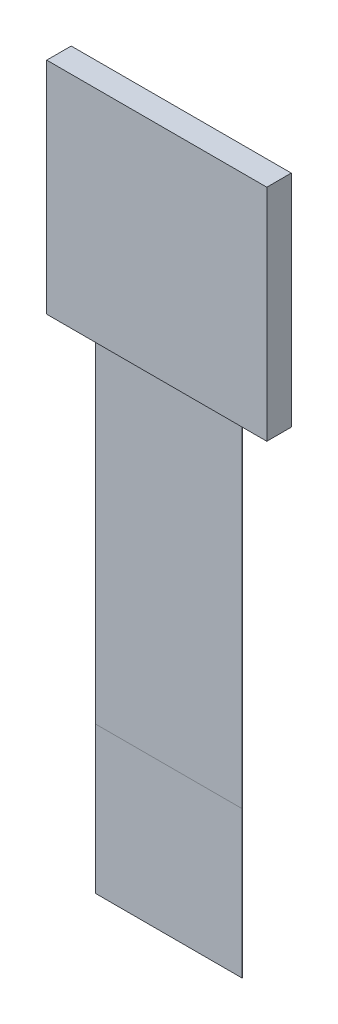
ISO-10303-21;
HEADER;
FILE_DESCRIPTION(('STEP AP214'),'2;1');
FILE_NAME('part.step','',(''),(''),'','','');
FILE_SCHEMA(('AUTOMOTIVE_DESIGN { 1 0 10303 214 1 1 1 1 }'));
ENDSEC;
DATA;
#1=APPLICATION_CONTEXT('core data for automotive mechanical design processes');
#2=APPLICATION_PROTOCOL_DEFINITION('international standard','automotive_design',2000,#1);
#3=PRODUCT_CONTEXT('',#1,'mechanical');
#4=PRODUCT('Part','Part','',(#3));
#5=PRODUCT_RELATED_PRODUCT_CATEGORY('part','',(#4));
#6=PRODUCT_DEFINITION_FORMATION('','',#4);
#7=PRODUCT_DEFINITION_CONTEXT('part definition',#1,'design');
#8=PRODUCT_DEFINITION('design','',#6,#7);
#9=PRODUCT_DEFINITION_SHAPE('','',#8);
#10=(LENGTH_UNIT() NAMED_UNIT(*) SI_UNIT(.MILLI.,.METRE.));
#11=(NAMED_UNIT(*) PLANE_ANGLE_UNIT() SI_UNIT($,.RADIAN.));
#12=(NAMED_UNIT(*) SI_UNIT($,.STERADIAN.) SOLID_ANGLE_UNIT());
#13=UNCERTAINTY_MEASURE_WITH_UNIT(LENGTH_MEASURE(1.E-05),#10,'distance_accuracy_value','');
#14=(GEOMETRIC_REPRESENTATION_CONTEXT(3) GLOBAL_UNCERTAINTY_ASSIGNED_CONTEXT((#13)) GLOBAL_UNIT_ASSIGNED_CONTEXT((#10,
#11,#12)) REPRESENTATION_CONTEXT('',''));
#15=CARTESIAN_POINT('',(0.,0.,0.));
#16=DIRECTION('',(0.,0.,1.));
#17=DIRECTION('',(1.,0.,0.));
#18=AXIS2_PLACEMENT_3D('',#15,#16,#17);
#19=CARTESIAN_POINT('',(-15.,0.,0.075));
#20=DIRECTION('',(1.,0.,0.));
#21=DIRECTION('',(0.,1.,0.));
#22=AXIS2_PLACEMENT_3D('',#19,#20,#21);
#23=PLANE('',#22);
#24=DIRECTION('',(0.,-1.,0.));
#25=VECTOR('',#24,1.);
#26=CARTESIAN_POINT('',(-15.,0.,-0.075));
#27=LINE('',#26,#25);
#28=CARTESIAN_POINT('',(-15.,0.,-0.075));
#29=VERTEX_POINT('',#28);
#30=CARTESIAN_POINT('',(-15.,-70.,-0.07625));
#31=VERTEX_POINT('',#30);
#32=EDGE_CURVE('E140',#29,#31,#27,.T.);
#33=ORIENTED_EDGE('',*,*,#32,.T.);
#34=DIRECTION('',(0.,-1.,0.));
#35=VECTOR('',#34,1.);
#36=CARTESIAN_POINT('',(-15.,0.,-0.0775));
#37=LINE('',#36,#35);
#38=CARTESIAN_POINT('',(-15.,-100.,-0.0775));
#39=VERTEX_POINT('',#38);
#40=EDGE_CURVE('E162',#31,#39,#37,.T.);
#41=ORIENTED_EDGE('',*,*,#40,.T.);
#42=DIRECTION('',(0.,0.,-1.));
#43=VECTOR('',#42,1.);
#44=CARTESIAN_POINT('',(-15.,-100.,0.0775));
#45=LINE('',#44,#43);
#46=CARTESIAN_POINT('',(-15.,-100.,0.0775));
#47=VERTEX_POINT('',#46);
#48=EDGE_CURVE('E118',#47,#39,#45,.T.);
#49=ORIENTED_EDGE('',*,*,#48,.F.);
#50=DIRECTION('',(0.,-1.,0.));
#51=VECTOR('',#50,1.);
#52=CARTESIAN_POINT('',(-15.,0.,0.0775));
#53=LINE('',#52,#51);
#54=CARTESIAN_POINT('',(-15.,-70.,0.07625));
#55=VERTEX_POINT('',#54);
#56=EDGE_CURVE('E120',#55,#47,#53,.T.);
#57=ORIENTED_EDGE('',*,*,#56,.F.);
#58=DIRECTION('',(0.,-1.,0.));
#59=VECTOR('',#58,1.);
#60=CARTESIAN_POINT('',(-15.,0.,0.075));
#61=LINE('',#60,#59);
#62=CARTESIAN_POINT('',(-15.,0.,0.075));
#63=VERTEX_POINT('',#62);
#64=EDGE_CURVE('E59',#63,#55,#61,.T.);
#65=ORIENTED_EDGE('',*,*,#64,.F.);
#66=DIRECTION('',(0.,0.,-1.));
#67=VECTOR('',#66,1.);
#68=CARTESIAN_POINT('',(-15.,0.,0.075));
#69=LINE('',#68,#67);
#70=EDGE_CURVE('E50',#63,#29,#69,.T.);
#71=ORIENTED_EDGE('',*,*,#70,.T.);
#72=EDGE_LOOP('',(#33,#41,#49,#57,#65,#71));
#73=FACE_BOUND('',#72,.T.);
#74=ADVANCED_FACE('F41',(#73),#23,.F.);
#75=CARTESIAN_POINT('',(15.,0.,0.075));
#76=DIRECTION('',(1.,0.,0.));
#77=DIRECTION('',(0.,1.,0.));
#78=AXIS2_PLACEMENT_3D('',#75,#76,#77);
#79=PLANE('',#78);
#80=DIRECTION('',(0.,-1.,0.));
#81=VECTOR('',#80,1.);
#82=CARTESIAN_POINT('',(15.,0.,-0.075));
#83=LINE('',#82,#81);
#84=CARTESIAN_POINT('',(15.,0.,-0.075));
#85=VERTEX_POINT('',#84);
#86=CARTESIAN_POINT('',(15.,-70.,-0.07625));
#87=VERTEX_POINT('',#86);
#88=EDGE_CURVE('E72',#85,#87,#83,.T.);
#89=ORIENTED_EDGE('',*,*,#88,.F.);
#90=DIRECTION('',(0.,0.,-1.));
#91=VECTOR('',#90,1.);
#92=CARTESIAN_POINT('',(15.,0.,0.075));
#93=LINE('',#92,#91);
#94=CARTESIAN_POINT('',(15.,0.,0.075));
#95=VERTEX_POINT('',#94);
#96=EDGE_CURVE('E11',#95,#85,#93,.T.);
#97=ORIENTED_EDGE('',*,*,#96,.F.);
#98=DIRECTION('',(0.,-1.,0.));
#99=VECTOR('',#98,1.);
#100=CARTESIAN_POINT('',(15.,0.,0.075));
#101=LINE('',#100,#99);
#102=CARTESIAN_POINT('',(15.,-70.,0.07625));
#103=VERTEX_POINT('',#102);
#104=EDGE_CURVE('E105',#95,#103,#101,.T.);
#105=ORIENTED_EDGE('',*,*,#104,.T.);
#106=DIRECTION('',(0.,-1.,0.));
#107=VECTOR('',#106,1.);
#108=CARTESIAN_POINT('',(15.,0.,0.0775));
#109=LINE('',#108,#107);
#110=CARTESIAN_POINT('',(15.,-100.,0.0775));
#111=VERTEX_POINT('',#110);
#112=EDGE_CURVE('E113',#103,#111,#109,.T.);
#113=ORIENTED_EDGE('',*,*,#112,.T.);
#114=DIRECTION('',(0.,0.,-1.));
#115=VECTOR('',#114,1.);
#116=CARTESIAN_POINT('',(15.,-100.,0.0775));
#117=LINE('',#116,#115);
#118=CARTESIAN_POINT('',(15.,-100.,-0.0775));
#119=VERTEX_POINT('',#118);
#120=EDGE_CURVE('E116',#111,#119,#117,.T.);
#121=ORIENTED_EDGE('',*,*,#120,.T.);
#122=DIRECTION('',(0.,-1.,0.));
#123=VECTOR('',#122,1.);
#124=CARTESIAN_POINT('',(15.,0.,-0.0775));
#125=LINE('',#124,#123);
#126=EDGE_CURVE('E198',#87,#119,#125,.T.);
#127=ORIENTED_EDGE('',*,*,#126,.F.);
#128=EDGE_LOOP('',(#89,#97,#105,#113,#121,#127));
#129=FACE_BOUND('',#128,.T.);
#130=ADVANCED_FACE('F112',(#129),#79,.T.);
#131=CARTESIAN_POINT('',(0.,0.,0.075));
#132=DIRECTION('',(0.,0.,1.));
#133=DIRECTION('',(1.,0.,0.));
#134=AXIS2_PLACEMENT_3D('',#131,#132,#133);
#135=PLANE('',#134);
#136=ORIENTED_EDGE('',*,*,#64,.T.);
#137=CARTESIAN_POINT('',(-15.,-70.,0.075));
#138=DIRECTION('',(1.,0.,0.));
#139=VECTOR('',#138,1.);
#140=LINE('',#137,#139);
#141=EDGE_CURVE('E101',#55,#103,#140,.T.);
#142=ORIENTED_EDGE('',*,*,#141,.T.);
#143=ORIENTED_EDGE('',*,*,#104,.F.);
#144=DIRECTION('',(1.,0.,0.));
#145=VECTOR('',#144,1.);
#146=CARTESIAN_POINT('',(0.,0.,0.075));
#147=LINE('',#146,#145);
#148=EDGE_CURVE('E114',#63,#95,#147,.T.);
#149=ORIENTED_EDGE('',*,*,#148,.F.);
#150=EDGE_LOOP('',(#136,#142,#143,#149));
#151=FACE_BOUND('',#150,.T.);
#152=ADVANCED_FACE('F104',(#151),#135,.T.);
#153=CARTESIAN_POINT('',(0.,0.,-0.075));
#154=DIRECTION('',(0.,0.,1.));
#155=DIRECTION('',(1.,0.,0.));
#156=AXIS2_PLACEMENT_3D('',#153,#154,#155);
#157=PLANE('',#156);
#158=ORIENTED_EDGE('',*,*,#32,.F.);
#159=DIRECTION('',(1.,0.,0.));
#160=VECTOR('',#159,1.);
#161=CARTESIAN_POINT('',(0.,0.,-0.075));
#162=LINE('',#161,#160);
#163=EDGE_CURVE('E129',#29,#85,#162,.T.);
#164=ORIENTED_EDGE('',*,*,#163,.T.);
#165=ORIENTED_EDGE('',*,*,#88,.T.);
#166=CARTESIAN_POINT('',(-15.,-70.,-0.0775));
#167=DIRECTION('',(1.,0.,0.));
#168=VECTOR('',#167,1.);
#169=LINE('',#166,#168);
#170=EDGE_CURVE('E134',#31,#87,#169,.T.);
#171=ORIENTED_EDGE('',*,*,#170,.F.);
#172=EDGE_LOOP('',(#158,#164,#165,#171));
#173=FACE_BOUND('',#172,.T.);
#174=ADVANCED_FACE('F142',(#173),#157,.F.);
#175=CARTESIAN_POINT('',(0.,-100.,0.0775));
#176=DIRECTION('',(0.,1.,0.));
#177=DIRECTION('',(0.,0.,1.));
#178=AXIS2_PLACEMENT_3D('',#175,#176,#177);
#179=PLANE('',#178);
#180=DIRECTION('',(1.,0.,0.));
#181=VECTOR('',#180,1.);
#182=CARTESIAN_POINT('',(0.,-100.,-0.0775));
#183=LINE('',#182,#181);
#184=EDGE_CURVE('E197',#39,#119,#183,.T.);
#185=ORIENTED_EDGE('',*,*,#184,.T.);
#186=ORIENTED_EDGE('',*,*,#120,.F.);
#187=DIRECTION('',(1.,0.,0.));
#188=VECTOR('',#187,1.);
#189=CARTESIAN_POINT('',(0.,-100.,0.0775));
#190=LINE('',#189,#188);
#191=EDGE_CURVE('E82',#47,#111,#190,.T.);
#192=ORIENTED_EDGE('',*,*,#191,.F.);
#193=ORIENTED_EDGE('',*,*,#48,.T.);
#194=EDGE_LOOP('',(#185,#186,#192,#193));
#195=FACE_BOUND('',#194,.T.);
#196=ADVANCED_FACE('F151',(#195),#179,.F.);
#197=CARTESIAN_POINT('',(0.,0.,0.0775));
#198=DIRECTION('',(0.,0.,1.));
#199=DIRECTION('',(1.,0.,0.));
#200=AXIS2_PLACEMENT_3D('',#197,#198,#199);
#201=PLANE('',#200);
#202=ORIENTED_EDGE('',*,*,#141,.F.);
#203=ORIENTED_EDGE('',*,*,#56,.T.);
#204=ORIENTED_EDGE('',*,*,#191,.T.);
#205=ORIENTED_EDGE('',*,*,#112,.F.);
#206=EDGE_LOOP('',(#202,#203,#204,#205));
#207=FACE_BOUND('',#206,.T.);
#208=ADVANCED_FACE('F115',(#207),#201,.T.);
#209=CARTESIAN_POINT('',(0.,0.,-0.0775));
#210=DIRECTION('',(0.,0.,1.));
#211=DIRECTION('',(1.,0.,0.));
#212=AXIS2_PLACEMENT_3D('',#209,#210,#211);
#213=PLANE('',#212);
#214=ORIENTED_EDGE('',*,*,#170,.T.);
#215=ORIENTED_EDGE('',*,*,#126,.T.);
#216=ORIENTED_EDGE('',*,*,#184,.F.);
#217=ORIENTED_EDGE('',*,*,#40,.F.);
#218=EDGE_LOOP('',(#214,#215,#216,#217));
#219=FACE_BOUND('',#218,.T.);
#220=ADVANCED_FACE('F181',(#219),#213,.F.);
#221=CARTESIAN_POINT('',(22.5,0.,2.5));
#222=DIRECTION('',(1.,0.,0.));
#223=DIRECTION('',(0.,1.,0.));
#224=AXIS2_PLACEMENT_3D('',#221,#222,#223);
#225=PLANE('',#224);
#226=DIRECTION('',(0.,-1.,0.));
#227=VECTOR('',#226,1.);
#228=CARTESIAN_POINT('',(22.5,0.,-2.5));
#229=LINE('',#228,#227);
#230=CARTESIAN_POINT('',(22.5,45.,-2.5));
#231=VERTEX_POINT('',#230);
#232=CARTESIAN_POINT('',(22.5,0.,-2.5));
#233=VERTEX_POINT('',#232);
#234=EDGE_CURVE('E243',#231,#233,#229,.T.);
#235=ORIENTED_EDGE('',*,*,#234,.F.);
#236=DIRECTION('',(0.,0.,-1.));
#237=VECTOR('',#236,1.);
#238=CARTESIAN_POINT('',(22.5,45.,2.5));
#239=LINE('',#238,#237);
#240=CARTESIAN_POINT('',(22.5,45.,2.5));
#241=VERTEX_POINT('',#240);
#242=EDGE_CURVE('E263',#241,#231,#239,.T.);
#243=ORIENTED_EDGE('',*,*,#242,.F.);
#244=DIRECTION('',(0.,-1.,0.));
#245=VECTOR('',#244,1.);
#246=CARTESIAN_POINT('',(22.5,0.,2.5));
#247=LINE('',#246,#245);
#248=CARTESIAN_POINT('',(22.5,0.,2.5));
#249=VERTEX_POINT('',#248);
#250=EDGE_CURVE('E238',#241,#249,#247,.T.);
#251=ORIENTED_EDGE('',*,*,#250,.T.);
#252=DIRECTION('',(0.,0.,-1.));
#253=VECTOR('',#252,1.);
#254=CARTESIAN_POINT('',(22.5,0.,2.5));
#255=LINE('',#254,#253);
#256=EDGE_CURVE('E229',#249,#233,#255,.T.);
#257=ORIENTED_EDGE('',*,*,#256,.T.);
#258=EDGE_LOOP('',(#235,#243,#251,#257));
#259=FACE_BOUND('',#258,.T.);
#260=ADVANCED_FACE('F190',(#259),#225,.T.);
#261=CARTESIAN_POINT('',(0.,45.,2.5));
#262=DIRECTION('',(0.,1.,0.));
#263=DIRECTION('',(-1.,0.,0.));
#264=AXIS2_PLACEMENT_3D('',#261,#262,#263);
#265=PLANE('',#264);
#266=DIRECTION('',(1.,0.,0.));
#267=VECTOR('',#266,1.);
#268=CARTESIAN_POINT('',(0.,45.,-2.5));
#269=LINE('',#268,#267);
#270=CARTESIAN_POINT('',(-22.5,45.,-2.5));
#271=VERTEX_POINT('',#270);
#272=EDGE_CURVE('E247',#271,#231,#269,.T.);
#273=ORIENTED_EDGE('',*,*,#272,.F.);
#274=DIRECTION('',(0.,0.,-1.));
#275=VECTOR('',#274,1.);
#276=CARTESIAN_POINT('',(-22.5,45.,2.5));
#277=LINE('',#276,#275);
#278=CARTESIAN_POINT('',(-22.5,45.,2.5));
#279=VERTEX_POINT('',#278);
#280=EDGE_CURVE('E260',#279,#271,#277,.T.);
#281=ORIENTED_EDGE('',*,*,#280,.F.);
#282=DIRECTION('',(1.,0.,0.));
#283=VECTOR('',#282,1.);
#284=CARTESIAN_POINT('',(0.,45.,2.5));
#285=LINE('',#284,#283);
#286=EDGE_CURVE('E271',#279,#241,#285,.T.);
#287=ORIENTED_EDGE('',*,*,#286,.T.);
#288=ORIENTED_EDGE('',*,*,#242,.T.);
#289=EDGE_LOOP('',(#273,#281,#287,#288));
#290=FACE_BOUND('',#289,.T.);
#291=ADVANCED_FACE('F267',(#290),#265,.T.);
#292=CARTESIAN_POINT('',(-22.5,0.,2.5));
#293=DIRECTION('',(1.,0.,0.));
#294=DIRECTION('',(0.,1.,0.));
#295=AXIS2_PLACEMENT_3D('',#292,#293,#294);
#296=PLANE('',#295);
#297=DIRECTION('',(0.,-1.,0.));
#298=VECTOR('',#297,1.);
#299=CARTESIAN_POINT('',(-22.5,0.,-2.5));
#300=LINE('',#299,#298);
#301=CARTESIAN_POINT('',(-22.5,0.,-2.5));
#302=VERTEX_POINT('',#301);
#303=EDGE_CURVE('E239',#271,#302,#300,.T.);
#304=ORIENTED_EDGE('',*,*,#303,.T.);
#305=DIRECTION('',(0.,0.,-1.));
#306=VECTOR('',#305,1.);
#307=CARTESIAN_POINT('',(-22.5,0.,2.5));
#308=LINE('',#307,#306);
#309=CARTESIAN_POINT('',(-22.5,0.,2.5));
#310=VERTEX_POINT('',#309);
#311=EDGE_CURVE('E233',#310,#302,#308,.T.);
#312=ORIENTED_EDGE('',*,*,#311,.F.);
#313=DIRECTION('',(0.,-1.,0.));
#314=VECTOR('',#313,1.);
#315=CARTESIAN_POINT('',(-22.5,0.,2.5));
#316=LINE('',#315,#314);
#317=EDGE_CURVE('E280',#279,#310,#316,.T.);
#318=ORIENTED_EDGE('',*,*,#317,.F.);
#319=ORIENTED_EDGE('',*,*,#280,.T.);
#320=EDGE_LOOP('',(#304,#312,#318,#319));
#321=FACE_BOUND('',#320,.T.);
#322=ADVANCED_FACE('F218',(#321),#296,.F.);
#323=CARTESIAN_POINT('',(0.,0.,2.5));
#324=DIRECTION('',(0.,1.,0.));
#325=DIRECTION('',(-1.,0.,0.));
#326=AXIS2_PLACEMENT_3D('',#323,#324,#325);
#327=PLANE('',#326);
#328=ORIENTED_EDGE('',*,*,#163,.F.);
#329=ORIENTED_EDGE('',*,*,#70,.F.);
#330=ORIENTED_EDGE('',*,*,#148,.T.);
#331=ORIENTED_EDGE('',*,*,#96,.T.);
#332=EDGE_LOOP('',(#328,#329,#330,#331));
#333=FACE_BOUND('',#332,.T.);
#334=DIRECTION('',(1.,0.,0.));
#335=VECTOR('',#334,1.);
#336=CARTESIAN_POINT('',(0.,0.,-2.5));
#337=LINE('',#336,#335);
#338=EDGE_CURVE('E225',#302,#233,#337,.T.);
#339=ORIENTED_EDGE('',*,*,#338,.T.);
#340=ORIENTED_EDGE('',*,*,#256,.F.);
#341=DIRECTION('',(1.,0.,0.));
#342=VECTOR('',#341,1.);
#343=CARTESIAN_POINT('',(0.,0.,2.5));
#344=LINE('',#343,#342);
#345=EDGE_CURVE('E253',#310,#249,#344,.T.);
#346=ORIENTED_EDGE('',*,*,#345,.F.);
#347=ORIENTED_EDGE('',*,*,#311,.T.);
#348=EDGE_LOOP('',(#339,#340,#346,#347));
#349=FACE_BOUND('',#348,.T.);
#350=ADVANCED_FACE('F214',(#333,#349),#327,.F.);
#351=CARTESIAN_POINT('',(0.,0.,2.5));
#352=DIRECTION('',(0.,0.,1.));
#353=DIRECTION('',(1.,0.,0.));
#354=AXIS2_PLACEMENT_3D('',#351,#352,#353);
#355=PLANE('',#354);
#356=ORIENTED_EDGE('',*,*,#250,.F.);
#357=ORIENTED_EDGE('',*,*,#286,.F.);
#358=ORIENTED_EDGE('',*,*,#317,.T.);
#359=ORIENTED_EDGE('',*,*,#345,.T.);
#360=EDGE_LOOP('',(#356,#357,#358,#359));
#361=FACE_BOUND('',#360,.T.);
#362=ADVANCED_FACE('F217',(#361),#355,.T.);
#363=CARTESIAN_POINT('',(0.,0.,-2.5));
#364=DIRECTION('',(0.,0.,1.));
#365=DIRECTION('',(1.,0.,0.));
#366=AXIS2_PLACEMENT_3D('',#363,#364,#365);
#367=PLANE('',#366);
#368=ORIENTED_EDGE('',*,*,#234,.T.);
#369=ORIENTED_EDGE('',*,*,#338,.F.);
#370=ORIENTED_EDGE('',*,*,#303,.F.);
#371=ORIENTED_EDGE('',*,*,#272,.T.);
#372=EDGE_LOOP('',(#368,#369,#370,#371));
#373=FACE_BOUND('',#372,.T.);
#374=ADVANCED_FACE('F244',(#373),#367,.F.);
#375=CLOSED_SHELL('',(#74,#130,#152,#174,#196,#208,#220,#260,#291,#322,#350,#362,#374));
#376=MANIFOLD_SOLID_BREP('B2',#375);
#377=ADVANCED_BREP_SHAPE_REPRESENTATION('',(#18,#376),#14);
#378=SHAPE_DEFINITION_REPRESENTATION(#9,#377);
ENDSEC;
END-ISO-10303-21;
